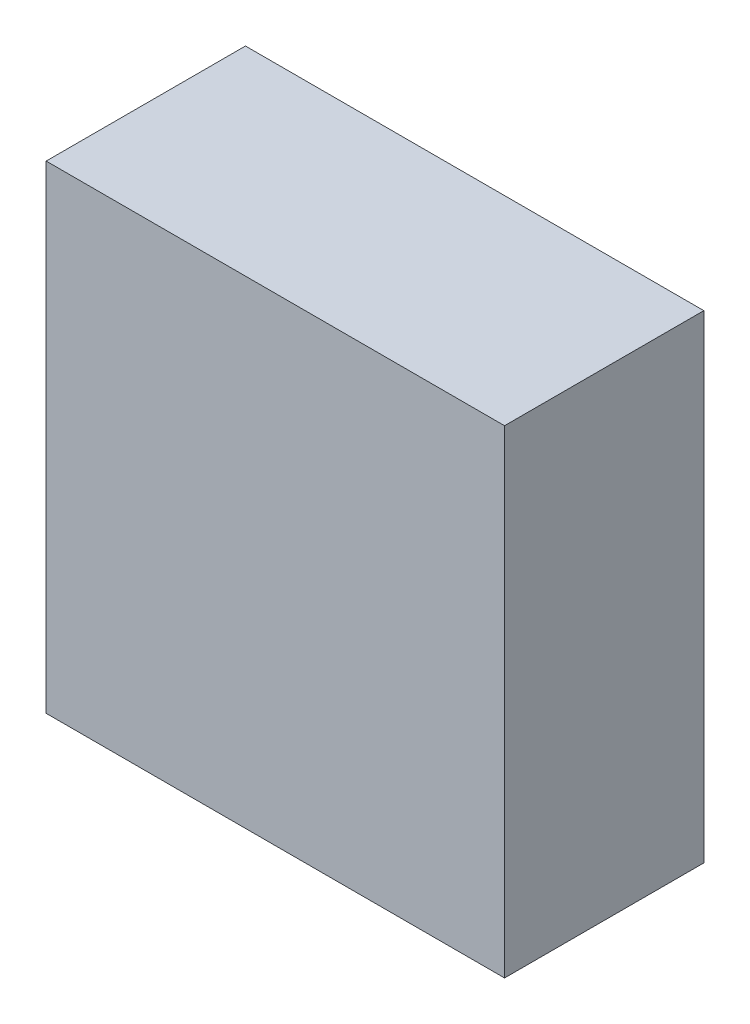
ISO-10303-21;
HEADER;
FILE_DESCRIPTION(('STEP AP214'),'2;1');
FILE_NAME('part.step','',(''),(''),'','','');
FILE_SCHEMA(('AUTOMOTIVE_DESIGN { 1 0 10303 214 1 1 1 1 }'));
ENDSEC;
DATA;
#1=APPLICATION_CONTEXT('core data for automotive mechanical design processes');
#2=APPLICATION_PROTOCOL_DEFINITION('international standard','automotive_design',2000,#1);
#3=PRODUCT_CONTEXT('',#1,'mechanical');
#4=PRODUCT('Part','Part','',(#3));
#5=PRODUCT_RELATED_PRODUCT_CATEGORY('part','',(#4));
#6=PRODUCT_DEFINITION_FORMATION('','',#4);
#7=PRODUCT_DEFINITION_CONTEXT('part definition',#1,'design');
#8=PRODUCT_DEFINITION('design','',#6,#7);
#9=PRODUCT_DEFINITION_SHAPE('','',#8);
#10=(LENGTH_UNIT() NAMED_UNIT(*) SI_UNIT(.MILLI.,.METRE.));
#11=(NAMED_UNIT(*) PLANE_ANGLE_UNIT() SI_UNIT($,.RADIAN.));
#12=(NAMED_UNIT(*) SI_UNIT($,.STERADIAN.) SOLID_ANGLE_UNIT());
#13=UNCERTAINTY_MEASURE_WITH_UNIT(LENGTH_MEASURE(1.E-05),#10,'distance_accuracy_value','');
#14=(GEOMETRIC_REPRESENTATION_CONTEXT(3) GLOBAL_UNCERTAINTY_ASSIGNED_CONTEXT((#13)) GLOBAL_UNIT_ASSIGNED_CONTEXT((#10,
#11,#12)) REPRESENTATION_CONTEXT('',''));
#15=CARTESIAN_POINT('',(0.,0.,0.));
#16=DIRECTION('',(0.,0.,1.));
#17=DIRECTION('',(1.,0.,0.));
#18=AXIS2_PLACEMENT_3D('',#15,#16,#17);
#19=CARTESIAN_POINT('',(-0.2921,0.3048,0.254));
#20=DIRECTION('',(0.,0.,-1.));
#21=DIRECTION('',(0.,-1.,0.));
#22=AXIS2_PLACEMENT_3D('',#19,#20,#21);
#23=PLANE('',#22);
#24=DIRECTION('',(0.,-1.,0.));
#25=VECTOR('',#24,1.);
#26=CARTESIAN_POINT('',(-0.2921,0.3048,0.254));
#27=LINE('',#26,#25);
#28=CARTESIAN_POINT('',(-0.2921,0.3048,0.254));
#29=VERTEX_POINT('',#28);
#30=CARTESIAN_POINT('',(-0.2921,-0.3048,0.254));
#31=VERTEX_POINT('',#30);
#32=EDGE_CURVE('E81',#29,#31,#27,.T.);
#33=ORIENTED_EDGE('',*,*,#32,.T.);
#34=DIRECTION('',(1.,0.,0.));
#35=VECTOR('',#34,1.);
#36=CARTESIAN_POINT('',(-0.2921,-0.3048,0.254));
#37=LINE('',#36,#35);
#38=CARTESIAN_POINT('',(0.2921,-0.3048,0.254));
#39=VERTEX_POINT('',#38);
#40=EDGE_CURVE('E105',#31,#39,#37,.T.);
#41=ORIENTED_EDGE('',*,*,#40,.T.);
#42=DIRECTION('',(0.,1.,0.));
#43=VECTOR('',#42,1.);
#44=CARTESIAN_POINT('',(0.2921,-0.3048,0.254));
#45=LINE('',#44,#43);
#46=CARTESIAN_POINT('',(0.2921,0.3048,0.254));
#47=VERTEX_POINT('',#46);
#48=EDGE_CURVE('E73',#39,#47,#45,.T.);
#49=ORIENTED_EDGE('',*,*,#48,.T.);
#50=DIRECTION('',(-1.,0.,0.));
#51=VECTOR('',#50,1.);
#52=CARTESIAN_POINT('',(0.2921,0.3048,0.254));
#53=LINE('',#52,#51);
#54=EDGE_CURVE('E10',#47,#29,#53,.T.);
#55=ORIENTED_EDGE('',*,*,#54,.T.);
#56=EDGE_LOOP('',(#33,#41,#49,#55));
#57=FACE_BOUND('',#56,.T.);
#58=ADVANCED_FACE('F16',(#57),#23,.F.);
#59=CARTESIAN_POINT('',(-0.2921,0.3048,0.));
#60=DIRECTION('',(0.,0.,-1.));
#61=DIRECTION('',(0.,-1.,0.));
#62=AXIS2_PLACEMENT_3D('',#59,#60,#61);
#63=PLANE('',#62);
#64=DIRECTION('',(-1.,0.,0.));
#65=VECTOR('',#64,1.);
#66=CARTESIAN_POINT('',(0.2921,0.3048,0.));
#67=LINE('',#66,#65);
#68=CARTESIAN_POINT('',(0.2921,0.3048,0.));
#69=VERTEX_POINT('',#68);
#70=CARTESIAN_POINT('',(-0.2921,0.3048,0.));
#71=VERTEX_POINT('',#70);
#72=EDGE_CURVE('E25',#69,#71,#67,.T.);
#73=ORIENTED_EDGE('',*,*,#72,.F.);
#74=DIRECTION('',(0.,1.,0.));
#75=VECTOR('',#74,1.);
#76=CARTESIAN_POINT('',(0.2921,-0.3048,0.));
#77=LINE('',#76,#75);
#78=CARTESIAN_POINT('',(0.2921,-0.3048,0.));
#79=VERTEX_POINT('',#78);
#80=EDGE_CURVE('E109',#79,#69,#77,.T.);
#81=ORIENTED_EDGE('',*,*,#80,.F.);
#82=DIRECTION('',(1.,0.,0.));
#83=VECTOR('',#82,1.);
#84=CARTESIAN_POINT('',(-0.2921,-0.3048,0.));
#85=LINE('',#84,#83);
#86=CARTESIAN_POINT('',(-0.2921,-0.3048,0.));
#87=VERTEX_POINT('',#86);
#88=EDGE_CURVE('E83',#87,#79,#85,.T.);
#89=ORIENTED_EDGE('',*,*,#88,.F.);
#90=DIRECTION('',(0.,-1.,0.));
#91=VECTOR('',#90,1.);
#92=CARTESIAN_POINT('',(-0.2921,0.3048,0.));
#93=LINE('',#92,#91);
#94=EDGE_CURVE('E79',#71,#87,#93,.T.);
#95=ORIENTED_EDGE('',*,*,#94,.F.);
#96=EDGE_LOOP('',(#73,#81,#89,#95));
#97=FACE_BOUND('',#96,.T.);
#98=ADVANCED_FACE('F18',(#97),#63,.T.);
#99=CARTESIAN_POINT('',(0.2921,0.3048,0.));
#100=DIRECTION('',(0.,-1.,0.));
#101=DIRECTION('',(0.,0.,-1.));
#102=AXIS2_PLACEMENT_3D('',#99,#100,#101);
#103=PLANE('',#102);
#104=ORIENTED_EDGE('',*,*,#72,.T.);
#105=DIRECTION('',(0.,0.,1.));
#106=VECTOR('',#105,1.);
#107=CARTESIAN_POINT('',(-0.2921,0.3048,0.));
#108=LINE('',#107,#106);
#109=EDGE_CURVE('E67',#71,#29,#108,.T.);
#110=ORIENTED_EDGE('',*,*,#109,.T.);
#111=ORIENTED_EDGE('',*,*,#54,.F.);
#112=DIRECTION('',(0.,0.,1.));
#113=VECTOR('',#112,1.);
#114=CARTESIAN_POINT('',(0.2921,0.3048,0.));
#115=LINE('',#114,#113);
#116=EDGE_CURVE('E70',#69,#47,#115,.T.);
#117=ORIENTED_EDGE('',*,*,#116,.F.);
#118=EDGE_LOOP('',(#104,#110,#111,#117));
#119=FACE_BOUND('',#118,.T.);
#120=ADVANCED_FACE('F66',(#119),#103,.F.);
#121=CARTESIAN_POINT('',(0.2921,-0.3048,0.));
#122=DIRECTION('',(-1.,0.,0.));
#123=DIRECTION('',(0.,0.,1.));
#124=AXIS2_PLACEMENT_3D('',#121,#122,#123);
#125=PLANE('',#124);
#126=ORIENTED_EDGE('',*,*,#80,.T.);
#127=ORIENTED_EDGE('',*,*,#116,.T.);
#128=ORIENTED_EDGE('',*,*,#48,.F.);
#129=DIRECTION('',(0.,0.,1.));
#130=VECTOR('',#129,1.);
#131=CARTESIAN_POINT('',(0.2921,-0.3048,0.));
#132=LINE('',#131,#130);
#133=EDGE_CURVE('E101',#79,#39,#132,.T.);
#134=ORIENTED_EDGE('',*,*,#133,.F.);
#135=EDGE_LOOP('',(#126,#127,#128,#134));
#136=FACE_BOUND('',#135,.T.);
#137=ADVANCED_FACE('F119',(#136),#125,.F.);
#138=CARTESIAN_POINT('',(-0.2921,-0.3048,0.));
#139=DIRECTION('',(0.,1.,0.));
#140=DIRECTION('',(1.,0.,0.));
#141=AXIS2_PLACEMENT_3D('',#138,#139,#140);
#142=PLANE('',#141);
#143=ORIENTED_EDGE('',*,*,#88,.T.);
#144=ORIENTED_EDGE('',*,*,#133,.T.);
#145=ORIENTED_EDGE('',*,*,#40,.F.);
#146=DIRECTION('',(0.,0.,1.));
#147=VECTOR('',#146,1.);
#148=CARTESIAN_POINT('',(-0.2921,-0.3048,0.));
#149=LINE('',#148,#147);
#150=EDGE_CURVE('E88',#87,#31,#149,.T.);
#151=ORIENTED_EDGE('',*,*,#150,.F.);
#152=EDGE_LOOP('',(#143,#144,#145,#151));
#153=FACE_BOUND('',#152,.T.);
#154=ADVANCED_FACE('F122',(#153),#142,.F.);
#155=CARTESIAN_POINT('',(-0.2921,0.3048,0.));
#156=DIRECTION('',(1.,0.,0.));
#157=DIRECTION('',(0.,1.,0.));
#158=AXIS2_PLACEMENT_3D('',#155,#156,#157);
#159=PLANE('',#158);
#160=ORIENTED_EDGE('',*,*,#94,.T.);
#161=ORIENTED_EDGE('',*,*,#150,.T.);
#162=ORIENTED_EDGE('',*,*,#32,.F.);
#163=ORIENTED_EDGE('',*,*,#109,.F.);
#164=EDGE_LOOP('',(#160,#161,#162,#163));
#165=FACE_BOUND('',#164,.T.);
#166=ADVANCED_FACE('F77',(#165),#159,.F.);
#167=CLOSED_SHELL('',(#58,#98,#120,#137,#154,#166));
#168=MANIFOLD_SOLID_BREP('B1',#167);
#169=ADVANCED_BREP_SHAPE_REPRESENTATION('',(#18,#168),#14);
#170=SHAPE_DEFINITION_REPRESENTATION(#9,#169);
ENDSEC;
END-ISO-10303-21;
